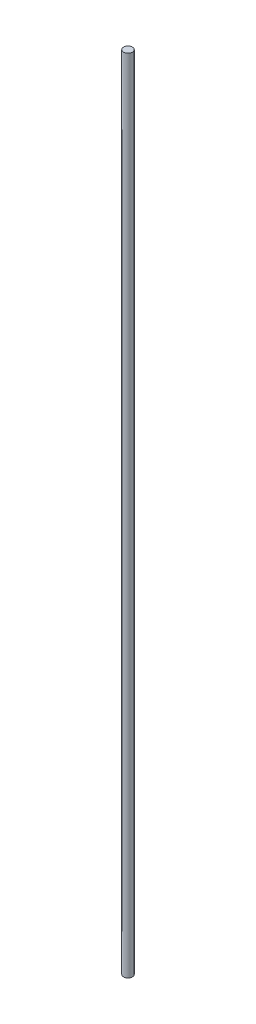
ISO-10303-21;
HEADER;
FILE_DESCRIPTION(('STEP AP214'),'2;1');
FILE_NAME('part.step','',(''),(''),'','','');
FILE_SCHEMA(('AUTOMOTIVE_DESIGN { 1 0 10303 214 1 1 1 1 }'));
ENDSEC;
DATA;
#1=APPLICATION_CONTEXT('core data for automotive mechanical design processes');
#2=APPLICATION_PROTOCOL_DEFINITION('international standard','automotive_design',2000,#1);
#3=PRODUCT_CONTEXT('',#1,'mechanical');
#4=PRODUCT('Part','Part','',(#3));
#5=PRODUCT_RELATED_PRODUCT_CATEGORY('part','',(#4));
#6=PRODUCT_DEFINITION_FORMATION('','',#4);
#7=PRODUCT_DEFINITION_CONTEXT('part definition',#1,'design');
#8=PRODUCT_DEFINITION('design','',#6,#7);
#9=PRODUCT_DEFINITION_SHAPE('','',#8);
#10=(LENGTH_UNIT() NAMED_UNIT(*) SI_UNIT(.MILLI.,.METRE.));
#11=(NAMED_UNIT(*) PLANE_ANGLE_UNIT() SI_UNIT($,.RADIAN.));
#12=(NAMED_UNIT(*) SI_UNIT($,.STERADIAN.) SOLID_ANGLE_UNIT());
#13=UNCERTAINTY_MEASURE_WITH_UNIT(LENGTH_MEASURE(1.E-05),#10,'distance_accuracy_value','');
#14=(GEOMETRIC_REPRESENTATION_CONTEXT(3) GLOBAL_UNCERTAINTY_ASSIGNED_CONTEXT((#13)) GLOBAL_UNIT_ASSIGNED_CONTEXT((#10,
#11,#12)) REPRESENTATION_CONTEXT('',''));
#15=CARTESIAN_POINT('',(0.,0.,0.));
#16=DIRECTION('',(0.,0.,1.));
#17=DIRECTION('',(1.,0.,0.));
#18=AXIS2_PLACEMENT_3D('',#15,#16,#17);
#19=CARTESIAN_POINT('',(0.,287.3375,0.));
#20=DIRECTION('',(0.,1.,0.));
#21=DIRECTION('',(0.,0.,1.));
#22=AXIS2_PLACEMENT_3D('',#19,#20,#21);
#23=PLANE('',#22);
#24=CARTESIAN_POINT('',(0.,287.3375,0.));
#25=DIRECTION('',(0.,1.,0.));
#26=DIRECTION('',(0.,0.,1.));
#27=AXIS2_PLACEMENT_3D('',#24,#25,#26);
#28=CIRCLE('',#27,3.175);
#29=CARTESIAN_POINT('',(0.,287.3375,3.175));
#30=VERTEX_POINT('',#29);
#31=EDGE_CURVE('E17',#30,#30,#28,.F.);
#32=ORIENTED_EDGE('',*,*,#31,.F.);
#33=EDGE_LOOP('',(#32));
#34=FACE_BOUND('',#33,.T.);
#35=ADVANCED_FACE('F14',(#34),#23,.T.);
#36=CARTESIAN_POINT('',(0.,-287.3375,0.));
#37=DIRECTION('',(0.,1.,0.));
#38=DIRECTION('',(0.,0.,1.));
#39=AXIS2_PLACEMENT_3D('',#36,#37,#38);
#40=PLANE('',#39);
#41=CARTESIAN_POINT('',(0.,-287.3375,0.));
#42=DIRECTION('',(0.,1.,0.));
#43=DIRECTION('',(0.,0.,1.));
#44=AXIS2_PLACEMENT_3D('',#41,#42,#43);
#45=CIRCLE('',#44,3.175);
#46=CARTESIAN_POINT('',(0.,-287.3375,3.175));
#47=VERTEX_POINT('',#46);
#48=EDGE_CURVE('E10',#47,#47,#45,.T.);
#49=ORIENTED_EDGE('',*,*,#48,.F.);
#50=EDGE_LOOP('',(#49));
#51=FACE_BOUND('',#50,.T.);
#52=ADVANCED_FACE('F29',(#51),#40,.F.);
#53=CARTESIAN_POINT('',(0.,-287.3375,0.));
#54=DIRECTION('',(0.,1.,0.));
#55=DIRECTION('',(0.,0.,1.));
#56=AXIS2_PLACEMENT_3D('',#53,#54,#55);
#57=CYLINDRICAL_SURFACE('',#56,3.175);
#58=ORIENTED_EDGE('',*,*,#31,.T.);
#59=EDGE_LOOP('',(#58));
#60=FACE_BOUND('',#59,.T.);
#61=ORIENTED_EDGE('',*,*,#48,.T.);
#62=EDGE_LOOP('',(#61));
#63=FACE_BOUND('',#62,.T.);
#64=ADVANCED_FACE('F26',(#60,#63),#57,.T.);
#65=CLOSED_SHELL('',(#35,#52,#64));
#66=MANIFOLD_SOLID_BREP('B1',#65);
#67=ADVANCED_BREP_SHAPE_REPRESENTATION('',(#18,#66),#14);
#68=SHAPE_DEFINITION_REPRESENTATION(#9,#67);
ENDSEC;
END-ISO-10303-21;
